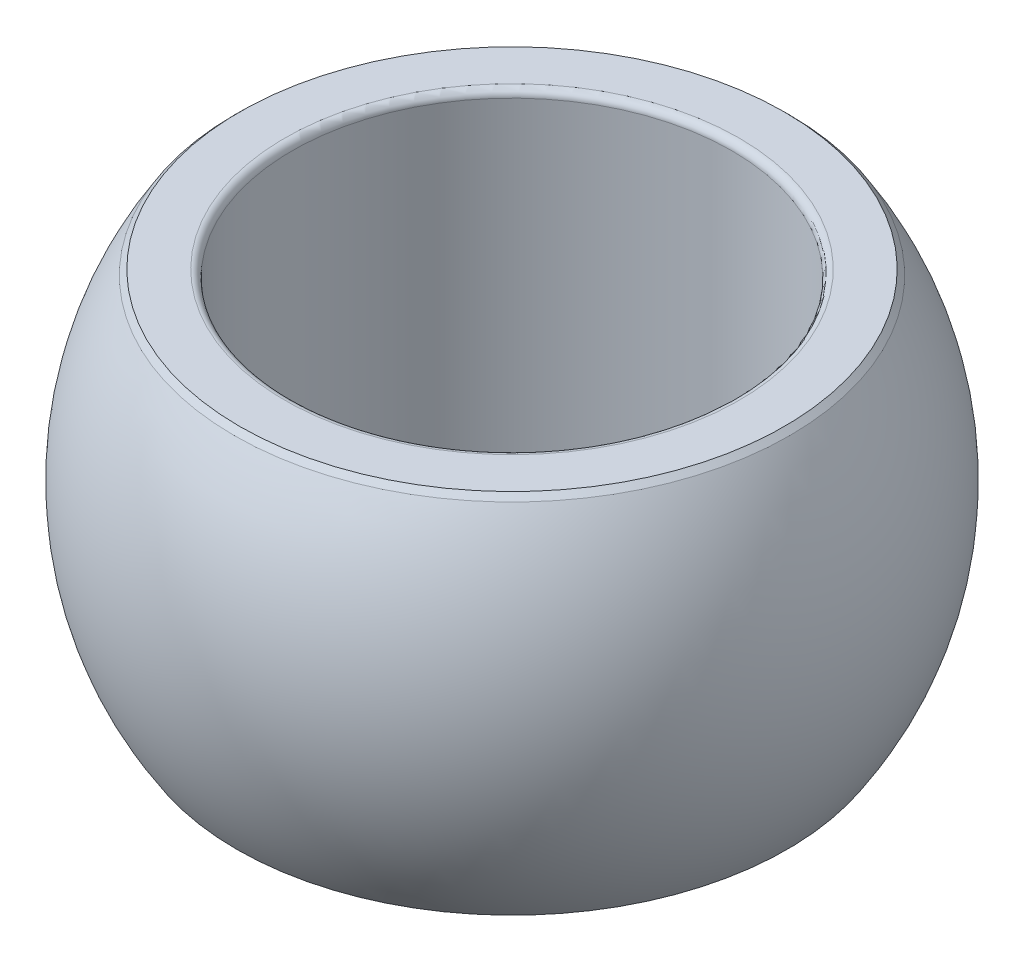
ISO-10303-21;
HEADER;
FILE_DESCRIPTION(('STEP AP214'),'2;1');
FILE_NAME('part.step','',(''),(''),'','','');
FILE_SCHEMA(('AUTOMOTIVE_DESIGN { 1 0 10303 214 1 1 1 1 }'));
ENDSEC;
DATA;
#1=APPLICATION_CONTEXT('core data for automotive mechanical design processes');
#2=APPLICATION_PROTOCOL_DEFINITION('international standard','automotive_design',2000,#1);
#3=PRODUCT_CONTEXT('',#1,'mechanical');
#4=PRODUCT('Part','Part','',(#3));
#5=PRODUCT_RELATED_PRODUCT_CATEGORY('part','',(#4));
#6=PRODUCT_DEFINITION_FORMATION('','',#4);
#7=PRODUCT_DEFINITION_CONTEXT('part definition',#1,'design');
#8=PRODUCT_DEFINITION('design','',#6,#7);
#9=PRODUCT_DEFINITION_SHAPE('','',#8);
#10=(LENGTH_UNIT() NAMED_UNIT(*) SI_UNIT(.MILLI.,.METRE.));
#11=(NAMED_UNIT(*) PLANE_ANGLE_UNIT() SI_UNIT($,.RADIAN.));
#12=(NAMED_UNIT(*) SI_UNIT($,.STERADIAN.) SOLID_ANGLE_UNIT());
#13=UNCERTAINTY_MEASURE_WITH_UNIT(LENGTH_MEASURE(1.E-05),#10,'distance_accuracy_value','');
#14=(GEOMETRIC_REPRESENTATION_CONTEXT(3) GLOBAL_UNCERTAINTY_ASSIGNED_CONTEXT((#13)) GLOBAL_UNIT_ASSIGNED_CONTEXT((#10,
#11,#12)) REPRESENTATION_CONTEXT('',''));
#15=CARTESIAN_POINT('',(0.,0.,0.));
#16=DIRECTION('',(0.,0.,1.));
#17=DIRECTION('',(1.,0.,0.));
#18=AXIS2_PLACEMENT_3D('',#15,#16,#17);
#19=CARTESIAN_POINT('',(-6.,5.,0.));
#20=DIRECTION('',(0.,-1.,0.));
#21=DIRECTION('',(0.,0.,-1.));
#22=AXIS2_PLACEMENT_3D('',#19,#20,#21);
#23=PLANE('',#22);
#24=CARTESIAN_POINT('',(0.,5.,0.));
#25=DIRECTION('',(0.,-1.,0.));
#26=DIRECTION('',(0.,0.,-1.));
#27=AXIS2_PLACEMENT_3D('',#24,#25,#26);
#28=CIRCLE('',#27,7.43331477354788);
#29=CARTESIAN_POINT('',(0.,5.,-7.43331477354788));
#30=VERTEX_POINT('',#29);
#31=EDGE_CURVE('E37',#30,#30,#28,.F.);
#32=ORIENTED_EDGE('',*,*,#31,.T.);
#33=EDGE_LOOP('',(#32));
#34=FACE_BOUND('',#33,.T.);
#35=CARTESIAN_POINT('',(0.,5.,0.));
#36=DIRECTION('',(0.,-1.,0.));
#37=DIRECTION('',(0.,0.,-1.));
#38=AXIS2_PLACEMENT_3D('',#35,#36,#37);
#39=CIRCLE('',#38,6.2);
#40=CARTESIAN_POINT('',(0.,5.,-6.2));
#41=VERTEX_POINT('',#40);
#42=EDGE_CURVE('E50',#41,#41,#39,.T.);
#43=ORIENTED_EDGE('',*,*,#42,.T.);
#44=EDGE_LOOP('',(#43));
#45=FACE_BOUND('',#44,.T.);
#46=ADVANCED_FACE('F30',(#34,#45),#23,.F.);
#47=CARTESIAN_POINT('',(0.,0.,0.));
#48=DIRECTION('',(0.,-1.,0.));
#49=DIRECTION('',(-1.,0.,0.));
#50=AXIS2_PLACEMENT_3D('',#47,#48,#49);
#51=SPHERICAL_SURFACE('',#50,9.);
#52=CARTESIAN_POINT('',(0.,4.85534517590201,0.));
#53=DIRECTION('',(0.,-1.,0.));
#54=DIRECTION('',(0.,0.,-1.));
#55=AXIS2_PLACEMENT_3D('',#52,#53,#54);
#56=CIRCLE('',#55,7.57796959764586);
#57=CARTESIAN_POINT('',(-7.57796959764586,4.85534517590201,0.));
#58=VERTEX_POINT('',#57);
#59=EDGE_CURVE('E41',#58,#58,#56,.T.);
#60=CARTESIAN_POINT('',(0.,-4.95846414064842,0.));
#61=DIRECTION('',(0.,1.,0.));
#62=DIRECTION('',(0.,0.,1.));
#63=AXIS2_PLACEMENT_3D('',#60,#61,#62);
#64=CIRCLE('',#63,7.51090096898526);
#65=CARTESIAN_POINT('',(-7.51090096898526,-4.95846414064842,0.));
#66=VERTEX_POINT('',#65);
#67=EDGE_CURVE('E45',#66,#66,#64,.T.);
#68=CARTESIAN_POINT('',(-7.57796959764586,4.85534517590201,0.));
#69=CARTESIAN_POINT('',(-7.63630095212111,4.76430632284534,0.));
#70=CARTESIAN_POINT('',(-7.69299019765347,4.67221540761034,0.));
#71=CARTESIAN_POINT('',(-7.80301427798296,4.48605109271907,0.));
#72=CARTESIAN_POINT('',(-7.85634911278008,4.3919776930628,0.));
#73=CARTESIAN_POINT('',(-7.95959417878965,4.20197004926438,0.));
#74=CARTESIAN_POINT('',(-8.00950441000209,4.10603580512223,0.));
#75=CARTESIAN_POINT('',(-8.10583569131535,3.91243121912061,0.));
#76=CARTESIAN_POINT('',(-8.15225674141617,3.81476087726114,0.));
#77=CARTESIAN_POINT('',(-8.24154930198328,3.6178109125973,0.));
#78=CARTESIAN_POINT('',(-8.28442081244956,3.51853128979293,0.));
#79=CARTESIAN_POINT('',(-8.36655862923982,3.31849171970745,0.));
#80=CARTESIAN_POINT('',(-8.40582493556379,3.21773177242634,0.));
#81=CARTESIAN_POINT('',(-8.48070133960167,3.01486241925231,0.));
#82=CARTESIAN_POINT('',(-8.5163114373156,2.91275301335938,0.));
#83=CARTESIAN_POINT('',(-8.58382917442692,2.70731736508201,0.));
#84=CARTESIAN_POINT('',(-8.61573681382432,2.60399112269758,0.));
#85=CARTESIAN_POINT('',(-8.67580819179723,2.39625600305174,0.));
#86=CARTESIAN_POINT('',(-8.70397193037273,2.29184712579034,0.));
#87=CARTESIAN_POINT('',(-8.75651892726819,2.08208234440437,0.));
#88=CARTESIAN_POINT('',(-8.78090218558815,1.97672644027979,0.));
#89=CARTESIAN_POINT('',(-8.82585655257282,1.76520444312683,0.));
#90=CARTESIAN_POINT('',(-8.84642766123751,1.65903835009844,0.));
#91=CARTESIAN_POINT('',(-8.88373101082535,1.44603386540219,0.));
#92=CARTESIAN_POINT('',(-8.90046325174848,1.33919547373432,0.));
#93=CARTESIAN_POINT('',(-8.93006713374288,1.12498515521099,0.));
#94=CARTESIAN_POINT('',(-8.94293877481414,1.01761322835553,0.));
#95=CARTESIAN_POINT('',(-8.96480473920701,0.802475295874459,0.));
#96=CARTESIAN_POINT('',(-8.97379906252862,0.694709290248853,0.));
#97=CARTESIAN_POINT('',(-8.98789870944763,0.478923168480555,0.));
#98=CARTESIAN_POINT('',(-8.99300403304503,0.370903052337863,0.));
#99=CARTESIAN_POINT('',(-8.99931904963775,0.154749007831447,0.));
#100=CARTESIAN_POINT('',(-9.00052874263307,0.0466150794677231,0.));
#101=CARTESIAN_POINT('',(-8.99905092685253,-0.169626143363552,0.));
#102=CARTESIAN_POINT('',(-8.99636341807668,-0.277733437831102,0.));
#103=CARTESIAN_POINT('',(-8.98709468933422,-0.493780981345364,0.));
#104=CARTESIAN_POINT('',(-8.98051346936763,-0.601721230392075,0.));
#105=CARTESIAN_POINT('',(-8.96346586603993,-0.817294488501297,0.));
#106=CARTESIAN_POINT('',(-8.95299948267884,-0.924927497563808,0.));
#107=CARTESIAN_POINT('',(-8.92819514647241,-1.13974648018969,0.));
#108=CARTESIAN_POINT('',(-8.91385719362708,-1.24693245375305,0.));
#109=CARTESIAN_POINT('',(-8.88132834081969,-1.46071815048237,0.));
#110=CARTESIAN_POINT('',(-8.86313744085764,-1.56731787364832,0.));
#111=CARTESIAN_POINT('',(-8.82292632045736,-1.7797926161175,0.));
#112=CARTESIAN_POINT('',(-8.80090610001914,-1.88566763542073,0.));
#113=CARTESIAN_POINT('',(-8.75306493888297,-2.09655545795136,0.));
#114=CARTESIAN_POINT('',(-8.72724399818503,-2.20156826117877,0.));
#115=CARTESIAN_POINT('',(-8.6718349332144,-2.41059525922381,0.));
#116=CARTESIAN_POINT('',(-8.64224680894169,-2.51460945404143,0.));
#117=CARTESIAN_POINT('',(-8.57934180627137,-2.72150413987187,0.));
#118=CARTESIAN_POINT('',(-8.54602492787376,-2.8243846308847,0.));
#119=CARTESIAN_POINT('',(-8.47570568979891,-3.02887828644483,0.));
#120=CARTESIAN_POINT('',(-8.43870333012167,-3.13049145099215,0.));
#121=CARTESIAN_POINT('',(-8.36106118749709,-3.33231847601001,0.));
#122=CARTESIAN_POINT('',(-8.32042140454974,-3.43253233648056,0.));
#123=CARTESIAN_POINT('',(-8.23555720370781,-3.63143059681109,0.));
#124=CARTESIAN_POINT('',(-8.19133278581323,-3.73011499667108,0.));
#125=CARTESIAN_POINT('',(-8.09935673690767,-3.92582615215651,0.));
#126=CARTESIAN_POINT('',(-8.0516051058967,-4.02285290778195,0.));
#127=CARTESIAN_POINT('',(-7.95263671692141,-4.21512279482605,0.));
#128=CARTESIAN_POINT('',(-7.9014199589571,-4.3103659262447,0.));
#129=CARTESIAN_POINT('',(-7.79558759255622,-4.49894471237701,0.));
#130=CARTESIAN_POINT('',(-7.74097198411965,-4.59228036709068,0.));
#131=CARTESIAN_POINT('',(-7.62841376559045,-4.77692353060565,0.));
#132=CARTESIAN_POINT('',(-7.57047115549782,-4.86823103940696,0.));
#133=CARTESIAN_POINT('',(-7.51090096898526,-4.95846414064842,0.));
#134=B_SPLINE_CURVE_WITH_KNOTS('',3,(#68,#69,#70,#71,#72,#73,#74,#75,#76,#77,#78,#79,#80,#81,
#82,#83,#84,#85,#86,#87,#88,#89,#90,#91,#92,#93,#94,#95,#96,#97,#98,#99,#100,#101,#102,#103,
#104,#105,#106,#107,#108,#109,#110,#111,#112,#113,#114,#115,#116,#117,#118,#119,#120,#121,#122,
#123,#124,#125,#126,#127,#128,#129,#130,#131,#132,#133),.UNSPECIFIED.,.F.,.F.,(4,2,2,2,2,2,2,2,
2,2,2,2,2,2,2,2,2,2,2,2,2,2,2,2,2,2,2,2,2,2,2,2,4),(0.,0.324351856235621,0.648703712471243,
0.973055568706865,1.29740742494249,1.62175928117811,1.94611113741373,2.27046299364935,
2.59481484988497,2.9191667061206,3.24351856235622,3.56787041859184,3.89222227482746,
4.21657413106308,4.5409259872987,4.86527784353433,5.18962969976995,5.51398155600557,
5.83833341224119,6.16268526847681,6.48703712471243,6.81138898094806,7.13574083718368,
7.4600926934193,7.78444454965492,8.10879640589054,8.43314826212617,8.75750011836179,
9.08185197459741,9.40620383083303,9.73055568706865,10.0549075433043,10.3792593995399),.UNSPECIFIED.);
#135=EDGE_CURVE('BSEAM74',#58,#66,#134,.T.);
#136=ORIENTED_EDGE('',*,*,#59,.T.);
#137=ORIENTED_EDGE('',*,*,#67,.T.);
#138=ORIENTED_EDGE('',*,*,#135,.T.);
#139=ORIENTED_EDGE('',*,*,#135,.F.);
#140=EDGE_LOOP('',(#136,#138,#137,#139));
#141=FACE_BOUND('',#140,.T.);
#142=ADVANCED_FACE('F74',(#141),#51,.T.);
#143=CARTESIAN_POINT('',(-6.,-5.,0.));
#144=DIRECTION('',(0.,1.,0.));
#145=DIRECTION('',(0.,0.,1.));
#146=AXIS2_PLACEMENT_3D('',#143,#144,#145);
#147=PLANE('',#146);
#148=CARTESIAN_POINT('',(0.,-5.,0.));
#149=DIRECTION('',(0.,1.,0.));
#150=DIRECTION('',(0.,0.,1.));
#151=AXIS2_PLACEMENT_3D('',#148,#149,#150);
#152=CIRCLE('',#151,7.30210536554477);
#153=CARTESIAN_POINT('',(0.,-5.,7.30210536554477));
#154=VERTEX_POINT('',#153);
#155=EDGE_CURVE('E10',#154,#154,#152,.F.);
#156=ORIENTED_EDGE('',*,*,#155,.T.);
#157=EDGE_LOOP('',(#156));
#158=FACE_BOUND('',#157,.T.);
#159=CARTESIAN_POINT('',(0.,-5.,0.));
#160=DIRECTION('',(0.,1.,0.));
#161=DIRECTION('',(0.,0.,1.));
#162=AXIS2_PLACEMENT_3D('',#159,#160,#161);
#163=CIRCLE('',#162,6.2);
#164=CARTESIAN_POINT('',(0.,-5.,6.2));
#165=VERTEX_POINT('',#164);
#166=EDGE_CURVE('E53',#165,#165,#163,.T.);
#167=ORIENTED_EDGE('',*,*,#166,.T.);
#168=EDGE_LOOP('',(#167));
#169=FACE_BOUND('',#168,.T.);
#170=ADVANCED_FACE('F79',(#158,#169),#147,.F.);
#171=CARTESIAN_POINT('',(0.,0.,0.));
#172=DIRECTION('',(0.,-1.,0.));
#173=DIRECTION('',(0.,0.,-1.));
#174=AXIS2_PLACEMENT_3D('',#171,#172,#173);
#175=CYLINDRICAL_SURFACE('',#174,6.);
#176=CARTESIAN_POINT('',(0.,-4.8,0.));
#177=DIRECTION('',(0.,1.,0.));
#178=DIRECTION('',(0.,0.,1.));
#179=AXIS2_PLACEMENT_3D('',#176,#177,#178);
#180=CIRCLE('',#179,6.);
#181=CARTESIAN_POINT('',(0.,-4.8,6.));
#182=VERTEX_POINT('',#181);
#183=EDGE_CURVE('E56',#182,#182,#180,.F.);
#184=ORIENTED_EDGE('',*,*,#183,.T.);
#185=EDGE_LOOP('',(#184));
#186=FACE_BOUND('',#185,.T.);
#187=CARTESIAN_POINT('',(0.,4.8,0.));
#188=DIRECTION('',(0.,-1.,0.));
#189=DIRECTION('',(0.,0.,-1.));
#190=AXIS2_PLACEMENT_3D('',#187,#188,#189);
#191=CIRCLE('',#190,6.);
#192=CARTESIAN_POINT('',(0.,4.8,-6.));
#193=VERTEX_POINT('',#192);
#194=EDGE_CURVE('E59',#193,#193,#191,.F.);
#195=ORIENTED_EDGE('',*,*,#194,.T.);
#196=EDGE_LOOP('',(#195));
#197=FACE_BOUND('',#196,.T.);
#198=ADVANCED_FACE('F63',(#186,#197),#175,.F.);
#199=CARTESIAN_POINT('',(0.,-4.8,0.));
#200=DIRECTION('',(0.,1.,0.));
#201=DIRECTION('',(0.,0.,1.));
#202=AXIS2_PLACEMENT_3D('',#199,#200,#201);
#203=TOROIDAL_SURFACE('',#202,6.2,0.2);
#204=ORIENTED_EDGE('',*,*,#166,.F.);
#205=EDGE_LOOP('',(#204));
#206=FACE_BOUND('',#205,.T.);
#207=ORIENTED_EDGE('',*,*,#183,.F.);
#208=EDGE_LOOP('',(#207));
#209=FACE_BOUND('',#208,.T.);
#210=ADVANCED_FACE('F69',(#206,#209),#203,.T.);
#211=CARTESIAN_POINT('',(0.,4.8,0.));
#212=DIRECTION('',(0.,-1.,0.));
#213=DIRECTION('',(0.,0.,-1.));
#214=AXIS2_PLACEMENT_3D('',#211,#212,#213);
#215=TOROIDAL_SURFACE('',#214,6.2,0.2);
#216=ORIENTED_EDGE('',*,*,#194,.F.);
#217=EDGE_LOOP('',(#216));
#218=FACE_BOUND('',#217,.T.);
#219=ORIENTED_EDGE('',*,*,#42,.F.);
#220=EDGE_LOOP('',(#219));
#221=FACE_BOUND('',#220,.T.);
#222=ADVANCED_FACE('F65',(#218,#221),#215,.T.);
#223=CARTESIAN_POINT('',(0.,4.85534517590201,0.));
#224=DIRECTION('',(0.,-1.,0.));
#225=DIRECTION('',(0.,0.,-1.));
#226=AXIS2_PLACEMENT_3D('',#223,#224,#225);
#227=CONICAL_SURFACE('',#226,7.57796959764587,0.785398163397442);
#228=ORIENTED_EDGE('',*,*,#31,.F.);
#229=EDGE_LOOP('',(#228));
#230=FACE_BOUND('',#229,.T.);
#231=ORIENTED_EDGE('',*,*,#59,.F.);
#232=EDGE_LOOP('',(#231));
#233=FACE_BOUND('',#232,.T.);
#234=ADVANCED_FACE('F68',(#230,#233),#227,.T.);
#235=CARTESIAN_POINT('',(0.,-5.,0.));
#236=DIRECTION('',(0.,1.,0.));
#237=DIRECTION('',(0.,0.,1.));
#238=AXIS2_PLACEMENT_3D('',#235,#236,#237);
#239=CONICAL_SURFACE('',#238,7.30210536554477,1.37442913361372);
#240=ORIENTED_EDGE('',*,*,#67,.F.);
#241=EDGE_LOOP('',(#240));
#242=FACE_BOUND('',#241,.T.);
#243=ORIENTED_EDGE('',*,*,#155,.F.);
#244=EDGE_LOOP('',(#243));
#245=FACE_BOUND('',#244,.T.);
#246=ADVANCED_FACE('F32',(#242,#245),#239,.T.);
#247=CLOSED_SHELL('',(#46,#142,#170,#198,#210,#222,#234,#246));
#248=MANIFOLD_SOLID_BREP('B2',#247);
#249=ADVANCED_BREP_SHAPE_REPRESENTATION('',(#18,#248),#14);
#250=SHAPE_DEFINITION_REPRESENTATION(#9,#249);
ENDSEC;
END-ISO-10303-21;
